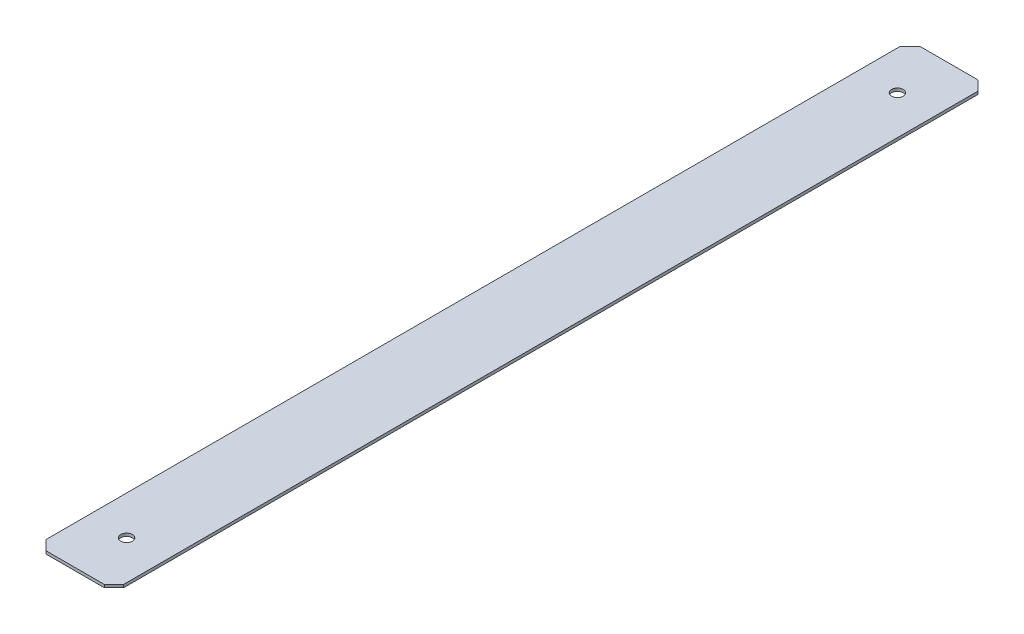
ISO-10303-21;
HEADER;
FILE_DESCRIPTION(('STEP AP214'),'2;1');
FILE_NAME('part.step','',(''),(''),'','','');
FILE_SCHEMA(('AUTOMOTIVE_DESIGN { 1 0 10303 214 1 1 1 1 }'));
ENDSEC;
DATA;
#1=APPLICATION_CONTEXT('core data for automotive mechanical design processes');
#2=APPLICATION_PROTOCOL_DEFINITION('international standard','automotive_design',2000,#1);
#3=PRODUCT_CONTEXT('',#1,'mechanical');
#4=PRODUCT('Part','Part','',(#3));
#5=PRODUCT_RELATED_PRODUCT_CATEGORY('part','',(#4));
#6=PRODUCT_DEFINITION_FORMATION('','',#4);
#7=PRODUCT_DEFINITION_CONTEXT('part definition',#1,'design');
#8=PRODUCT_DEFINITION('design','',#6,#7);
#9=PRODUCT_DEFINITION_SHAPE('','',#8);
#10=(LENGTH_UNIT() NAMED_UNIT(*) SI_UNIT(.MILLI.,.METRE.));
#11=(NAMED_UNIT(*) PLANE_ANGLE_UNIT() SI_UNIT($,.RADIAN.));
#12=(NAMED_UNIT(*) SI_UNIT($,.STERADIAN.) SOLID_ANGLE_UNIT());
#13=UNCERTAINTY_MEASURE_WITH_UNIT(LENGTH_MEASURE(1.E-05),#10,'distance_accuracy_value','');
#14=(GEOMETRIC_REPRESENTATION_CONTEXT(3) GLOBAL_UNCERTAINTY_ASSIGNED_CONTEXT((#13)) GLOBAL_UNIT_ASSIGNED_CONTEXT((#10,
#11,#12)) REPRESENTATION_CONTEXT('',''));
#15=CARTESIAN_POINT('',(0.,0.,0.));
#16=DIRECTION('',(0.,0.,1.));
#17=DIRECTION('',(1.,0.,0.));
#18=AXIS2_PLACEMENT_3D('',#15,#16,#17);
#19=CARTESIAN_POINT('',(20.,1.5,-225.));
#20=DIRECTION('',(-1.,0.,0.));
#21=DIRECTION('',(0.,0.,1.));
#22=AXIS2_PLACEMENT_3D('',#19,#20,#21);
#23=PLANE('',#22);
#24=DIRECTION('',(0.,0.,-1.));
#25=VECTOR('',#24,1.);
#26=CARTESIAN_POINT('',(20.,1.5,-225.));
#27=LINE('',#26,#25);
#28=CARTESIAN_POINT('',(20.0000000000001,1.5,220.));
#29=VERTEX_POINT('',#28);
#30=CARTESIAN_POINT('',(20.,1.5,-220.));
#31=VERTEX_POINT('',#30);
#32=EDGE_CURVE('E125',#29,#31,#27,.T.);
#33=ORIENTED_EDGE('',*,*,#32,.F.);
#34=DIRECTION('',(0.,-1.,0.));
#35=VECTOR('',#34,1.);
#36=CARTESIAN_POINT('',(20.,1.5,220.));
#37=LINE('',#36,#35);
#38=CARTESIAN_POINT('',(20.0000000000001,0.,220.));
#39=VERTEX_POINT('',#38);
#40=EDGE_CURVE('E151',#29,#39,#37,.T.);
#41=ORIENTED_EDGE('',*,*,#40,.T.);
#42=DIRECTION('',(0.,0.,-1.));
#43=VECTOR('',#42,1.);
#44=CARTESIAN_POINT('',(20.,0.,-225.));
#45=LINE('',#44,#43);
#46=CARTESIAN_POINT('',(20.,0.,-220.));
#47=VERTEX_POINT('',#46);
#48=EDGE_CURVE('E157',#39,#47,#45,.T.);
#49=ORIENTED_EDGE('',*,*,#48,.T.);
#50=DIRECTION('',(0.,1.,0.));
#51=VECTOR('',#50,1.);
#52=CARTESIAN_POINT('',(20.,1.5,-220.));
#53=LINE('',#52,#51);
#54=EDGE_CURVE('E149',#47,#31,#53,.T.);
#55=ORIENTED_EDGE('',*,*,#54,.T.);
#56=EDGE_LOOP('',(#33,#41,#49,#55));
#57=FACE_BOUND('',#56,.T.);
#58=ADVANCED_FACE('F33',(#57),#23,.F.);
#59=CARTESIAN_POINT('',(-20.,1.5,-225.));
#60=DIRECTION('',(0.,0.,1.));
#61=DIRECTION('',(1.,0.,0.));
#62=AXIS2_PLACEMENT_3D('',#59,#60,#61);
#63=PLANE('',#62);
#64=DIRECTION('',(-1.,0.,0.));
#65=VECTOR('',#64,1.);
#66=CARTESIAN_POINT('',(-20.,1.5,-225.));
#67=LINE('',#66,#65);
#68=CARTESIAN_POINT('',(15.,1.5,-225.));
#69=VERTEX_POINT('',#68);
#70=CARTESIAN_POINT('',(-15.,1.5,-225.));
#71=VERTEX_POINT('',#70);
#72=EDGE_CURVE('E128',#69,#71,#67,.T.);
#73=ORIENTED_EDGE('',*,*,#72,.F.);
#74=DIRECTION('',(0.,-1.,0.));
#75=VECTOR('',#74,1.);
#76=CARTESIAN_POINT('',(15.,1.5,-225.));
#77=LINE('',#76,#75);
#78=CARTESIAN_POINT('',(15.,0.,-225.));
#79=VERTEX_POINT('',#78);
#80=EDGE_CURVE('E11',#69,#79,#77,.T.);
#81=ORIENTED_EDGE('',*,*,#80,.T.);
#82=DIRECTION('',(-1.,0.,0.));
#83=VECTOR('',#82,1.);
#84=CARTESIAN_POINT('',(-20.,0.,-225.));
#85=LINE('',#84,#83);
#86=CARTESIAN_POINT('',(-15.,0.,-225.));
#87=VERTEX_POINT('',#86);
#88=EDGE_CURVE('E130',#79,#87,#85,.T.);
#89=ORIENTED_EDGE('',*,*,#88,.T.);
#90=DIRECTION('',(0.,1.,0.));
#91=VECTOR('',#90,1.);
#92=CARTESIAN_POINT('',(-15.,1.5,-225.));
#93=LINE('',#92,#91);
#94=EDGE_CURVE('E41',#87,#71,#93,.T.);
#95=ORIENTED_EDGE('',*,*,#94,.T.);
#96=EDGE_LOOP('',(#73,#81,#89,#95));
#97=FACE_BOUND('',#96,.T.);
#98=ADVANCED_FACE('F202',(#97),#63,.F.);
#99=CARTESIAN_POINT('',(-20.,1.5,-225.));
#100=DIRECTION('',(1.,0.,0.));
#101=DIRECTION('',(0.,0.,-1.));
#102=AXIS2_PLACEMENT_3D('',#99,#100,#101);
#103=PLANE('',#102);
#104=DIRECTION('',(0.,0.,1.));
#105=VECTOR('',#104,1.);
#106=CARTESIAN_POINT('',(-20.,0.,-225.));
#107=LINE('',#106,#105);
#108=CARTESIAN_POINT('',(-20.,0.,-220.));
#109=VERTEX_POINT('',#108);
#110=CARTESIAN_POINT('',(-20.,0.,220.));
#111=VERTEX_POINT('',#110);
#112=EDGE_CURVE('E126',#109,#111,#107,.T.);
#113=ORIENTED_EDGE('',*,*,#112,.T.);
#114=DIRECTION('',(0.,1.,0.));
#115=VECTOR('',#114,1.);
#116=CARTESIAN_POINT('',(-20.,1.5,220.));
#117=LINE('',#116,#115);
#118=CARTESIAN_POINT('',(-20.,1.5,220.));
#119=VERTEX_POINT('',#118);
#120=EDGE_CURVE('E104',#111,#119,#117,.T.);
#121=ORIENTED_EDGE('',*,*,#120,.T.);
#122=DIRECTION('',(0.,0.,1.));
#123=VECTOR('',#122,1.);
#124=CARTESIAN_POINT('',(-20.,1.5,-225.));
#125=LINE('',#124,#123);
#126=CARTESIAN_POINT('',(-20.,1.5,-220.));
#127=VERTEX_POINT('',#126);
#128=EDGE_CURVE('E169',#127,#119,#125,.T.);
#129=ORIENTED_EDGE('',*,*,#128,.F.);
#130=DIRECTION('',(0.,-1.,0.));
#131=VECTOR('',#130,1.);
#132=CARTESIAN_POINT('',(-20.,1.5,-220.));
#133=LINE('',#132,#131);
#134=EDGE_CURVE('E109',#127,#109,#133,.T.);
#135=ORIENTED_EDGE('',*,*,#134,.T.);
#136=EDGE_LOOP('',(#113,#121,#129,#135));
#137=FACE_BOUND('',#136,.T.);
#138=ADVANCED_FACE('F200',(#137),#103,.F.);
#139=CARTESIAN_POINT('',(-20.,1.5,225.));
#140=DIRECTION('',(0.,0.,-1.));
#141=DIRECTION('',(-1.,0.,0.));
#142=AXIS2_PLACEMENT_3D('',#139,#140,#141);
#143=PLANE('',#142);
#144=DIRECTION('',(1.,0.,0.));
#145=VECTOR('',#144,1.);
#146=CARTESIAN_POINT('',(-20.,1.5,225.));
#147=LINE('',#146,#145);
#148=CARTESIAN_POINT('',(-14.9999999999999,1.5,225.));
#149=VERTEX_POINT('',#148);
#150=CARTESIAN_POINT('',(15.,1.5,225.));
#151=VERTEX_POINT('',#150);
#152=EDGE_CURVE('E119',#149,#151,#147,.T.);
#153=ORIENTED_EDGE('',*,*,#152,.F.);
#154=DIRECTION('',(0.,-1.,0.));
#155=VECTOR('',#154,1.);
#156=CARTESIAN_POINT('',(-15.,1.5,225.));
#157=LINE('',#156,#155);
#158=CARTESIAN_POINT('',(-15.,0.,225.));
#159=VERTEX_POINT('',#158);
#160=EDGE_CURVE('E103',#149,#159,#157,.T.);
#161=ORIENTED_EDGE('',*,*,#160,.T.);
#162=DIRECTION('',(1.,0.,0.));
#163=VECTOR('',#162,1.);
#164=CARTESIAN_POINT('',(-20.,0.,225.));
#165=LINE('',#164,#163);
#166=CARTESIAN_POINT('',(15.,0.,225.));
#167=VERTEX_POINT('',#166);
#168=EDGE_CURVE('E116',#159,#167,#165,.T.);
#169=ORIENTED_EDGE('',*,*,#168,.T.);
#170=DIRECTION('',(0.,1.,0.));
#171=VECTOR('',#170,1.);
#172=CARTESIAN_POINT('',(15.,1.5,225.));
#173=LINE('',#172,#171);
#174=EDGE_CURVE('E121',#167,#151,#173,.T.);
#175=ORIENTED_EDGE('',*,*,#174,.T.);
#176=EDGE_LOOP('',(#153,#161,#169,#175));
#177=FACE_BOUND('',#176,.T.);
#178=ADVANCED_FACE('F115',(#177),#143,.F.);
#179=CARTESIAN_POINT('',(0.,1.5,0.));
#180=DIRECTION('',(0.,1.,0.));
#181=DIRECTION('',(0.,0.,1.));
#182=AXIS2_PLACEMENT_3D('',#179,#180,#181);
#183=PLANE('',#182);
#184=CARTESIAN_POINT('',(0.,1.5,-198.5));
#185=DIRECTION('',(0.,1.,0.));
#186=DIRECTION('',(0.,0.,1.));
#187=AXIS2_PLACEMENT_3D('',#184,#185,#186);
#188=CIRCLE('',#187,3.);
#189=CARTESIAN_POINT('',(0.,1.5,-195.5));
#190=VERTEX_POINT('',#189);
#191=EDGE_CURVE('E176',#190,#190,#188,.T.);
#192=ORIENTED_EDGE('',*,*,#191,.F.);
#193=EDGE_LOOP('',(#192));
#194=FACE_BOUND('',#193,.T.);
#195=CARTESIAN_POINT('',(0.,1.5,198.5));
#196=DIRECTION('',(0.,1.,0.));
#197=DIRECTION('',(0.,0.,-1.));
#198=AXIS2_PLACEMENT_3D('',#195,#196,#197);
#199=CIRCLE('',#198,3.);
#200=CARTESIAN_POINT('',(0.,1.5,195.5));
#201=VERTEX_POINT('',#200);
#202=EDGE_CURVE('E165',#201,#201,#199,.T.);
#203=ORIENTED_EDGE('',*,*,#202,.F.);
#204=EDGE_LOOP('',(#203));
#205=FACE_BOUND('',#204,.T.);
#206=ORIENTED_EDGE('',*,*,#128,.T.);
#207=DIRECTION('',(-0.707106781186548,0.,-0.707106781186548));
#208=VECTOR('',#207,1.);
#209=CARTESIAN_POINT('',(-120.,1.5,120.));
#210=LINE('',#209,#208);
#211=EDGE_CURVE('E147',#119,#149,#210,.F.);
#212=ORIENTED_EDGE('',*,*,#211,.T.);
#213=ORIENTED_EDGE('',*,*,#152,.T.);
#214=DIRECTION('',(-0.707106781186548,0.,0.707106781186548));
#215=VECTOR('',#214,1.);
#216=CARTESIAN_POINT('',(120.,1.5,120.));
#217=LINE('',#216,#215);
#218=EDGE_CURVE('E145',#151,#29,#217,.F.);
#219=ORIENTED_EDGE('',*,*,#218,.T.);
#220=ORIENTED_EDGE('',*,*,#32,.T.);
#221=DIRECTION('',(0.707106781186548,0.,0.707106781186548));
#222=VECTOR('',#221,1.);
#223=CARTESIAN_POINT('',(120.,1.5,-120.));
#224=LINE('',#223,#222);
#225=EDGE_CURVE('E54',#31,#69,#224,.F.);
#226=ORIENTED_EDGE('',*,*,#225,.T.);
#227=ORIENTED_EDGE('',*,*,#72,.T.);
#228=DIRECTION('',(0.707106781186551,0.,-0.707106781186544));
#229=VECTOR('',#228,1.);
#230=CARTESIAN_POINT('',(-120.,1.5,-120.000000000001));
#231=LINE('',#230,#229);
#232=EDGE_CURVE('E142',#71,#127,#231,.F.);
#233=ORIENTED_EDGE('',*,*,#232,.T.);
#234=EDGE_LOOP('',(#206,#212,#213,#219,#220,#226,#227,#233));
#235=FACE_BOUND('',#234,.T.);
#236=ADVANCED_FACE('F191',(#194,#205,#235),#183,.T.);
#237=CARTESIAN_POINT('',(0.,0.,0.));
#238=DIRECTION('',(0.,1.,0.));
#239=DIRECTION('',(0.,0.,1.));
#240=AXIS2_PLACEMENT_3D('',#237,#238,#239);
#241=PLANE('',#240);
#242=CARTESIAN_POINT('',(0.,0.,-198.5));
#243=DIRECTION('',(0.,1.,0.));
#244=DIRECTION('',(0.,0.,1.));
#245=AXIS2_PLACEMENT_3D('',#242,#243,#244);
#246=CIRCLE('',#245,3.);
#247=CARTESIAN_POINT('',(0.,0.,-195.5));
#248=VERTEX_POINT('',#247);
#249=EDGE_CURVE('E174',#248,#248,#246,.T.);
#250=ORIENTED_EDGE('',*,*,#249,.T.);
#251=EDGE_LOOP('',(#250));
#252=FACE_BOUND('',#251,.T.);
#253=CARTESIAN_POINT('',(0.,0.,198.5));
#254=DIRECTION('',(0.,1.,0.));
#255=DIRECTION('',(0.,0.,-1.));
#256=AXIS2_PLACEMENT_3D('',#253,#254,#255);
#257=CIRCLE('',#256,3.);
#258=CARTESIAN_POINT('',(0.,0.,195.5));
#259=VERTEX_POINT('',#258);
#260=EDGE_CURVE('E162',#259,#259,#257,.T.);
#261=ORIENTED_EDGE('',*,*,#260,.T.);
#262=EDGE_LOOP('',(#261));
#263=FACE_BOUND('',#262,.T.);
#264=ORIENTED_EDGE('',*,*,#168,.F.);
#265=DIRECTION('',(0.707106781186548,0.,0.707106781186548));
#266=VECTOR('',#265,1.);
#267=CARTESIAN_POINT('',(-15.,0.,225.));
#268=LINE('',#267,#266);
#269=EDGE_CURVE('E99',#159,#111,#268,.F.);
#270=ORIENTED_EDGE('',*,*,#269,.T.);
#271=ORIENTED_EDGE('',*,*,#112,.F.);
#272=DIRECTION('',(-0.707106781186551,0.,0.707106781186544));
#273=VECTOR('',#272,1.);
#274=CARTESIAN_POINT('',(-20.,0.,-220.));
#275=LINE('',#274,#273);
#276=EDGE_CURVE('E120',#109,#87,#275,.F.);
#277=ORIENTED_EDGE('',*,*,#276,.T.);
#278=ORIENTED_EDGE('',*,*,#88,.F.);
#279=DIRECTION('',(-0.707106781186548,0.,-0.707106781186548));
#280=VECTOR('',#279,1.);
#281=CARTESIAN_POINT('',(15.,0.,-225.));
#282=LINE('',#281,#280);
#283=EDGE_CURVE('E136',#79,#47,#282,.F.);
#284=ORIENTED_EDGE('',*,*,#283,.T.);
#285=ORIENTED_EDGE('',*,*,#48,.F.);
#286=DIRECTION('',(0.707106781186548,0.,-0.707106781186548));
#287=VECTOR('',#286,1.);
#288=CARTESIAN_POINT('',(20.,0.,220.));
#289=LINE('',#288,#287);
#290=EDGE_CURVE('E110',#39,#167,#289,.F.);
#291=ORIENTED_EDGE('',*,*,#290,.T.);
#292=EDGE_LOOP('',(#264,#270,#271,#277,#278,#284,#285,#291));
#293=FACE_BOUND('',#292,.T.);
#294=ADVANCED_FACE('F123',(#252,#263,#293),#241,.F.);
#295=CARTESIAN_POINT('',(-15.,1.5,225.));
#296=DIRECTION('',(0.707106781186547,0.,-0.707106781186547));
#297=DIRECTION('',(0.,-1.,0.));
#298=AXIS2_PLACEMENT_3D('',#295,#296,#297);
#299=PLANE('',#298);
#300=ORIENTED_EDGE('',*,*,#211,.F.);
#301=ORIENTED_EDGE('',*,*,#120,.F.);
#302=ORIENTED_EDGE('',*,*,#269,.F.);
#303=ORIENTED_EDGE('',*,*,#160,.F.);
#304=EDGE_LOOP('',(#300,#301,#302,#303));
#305=FACE_BOUND('',#304,.T.);
#306=ADVANCED_FACE('F102',(#305),#299,.F.);
#307=CARTESIAN_POINT('',(20.,1.5,220.));
#308=DIRECTION('',(-0.707106781186547,0.,-0.707106781186547));
#309=DIRECTION('',(0.,-1.,0.));
#310=AXIS2_PLACEMENT_3D('',#307,#308,#309);
#311=PLANE('',#310);
#312=ORIENTED_EDGE('',*,*,#218,.F.);
#313=ORIENTED_EDGE('',*,*,#174,.F.);
#314=ORIENTED_EDGE('',*,*,#290,.F.);
#315=ORIENTED_EDGE('',*,*,#40,.F.);
#316=EDGE_LOOP('',(#312,#313,#314,#315));
#317=FACE_BOUND('',#316,.T.);
#318=ADVANCED_FACE('F206',(#317),#311,.F.);
#319=CARTESIAN_POINT('',(15.,1.5,-225.));
#320=DIRECTION('',(-0.707106781186547,0.,0.707106781186547));
#321=DIRECTION('',(0.,-1.,0.));
#322=AXIS2_PLACEMENT_3D('',#319,#320,#321);
#323=PLANE('',#322);
#324=ORIENTED_EDGE('',*,*,#225,.F.);
#325=ORIENTED_EDGE('',*,*,#54,.F.);
#326=ORIENTED_EDGE('',*,*,#283,.F.);
#327=ORIENTED_EDGE('',*,*,#80,.F.);
#328=EDGE_LOOP('',(#324,#325,#326,#327));
#329=FACE_BOUND('',#328,.T.);
#330=ADVANCED_FACE('F205',(#329),#323,.F.);
#331=CARTESIAN_POINT('',(-20.,1.5,-220.));
#332=DIRECTION('',(0.707106781186544,0.,0.707106781186551));
#333=DIRECTION('',(0.,-1.,0.));
#334=AXIS2_PLACEMENT_3D('',#331,#332,#333);
#335=PLANE('',#334);
#336=ORIENTED_EDGE('',*,*,#232,.F.);
#337=ORIENTED_EDGE('',*,*,#94,.F.);
#338=ORIENTED_EDGE('',*,*,#276,.F.);
#339=ORIENTED_EDGE('',*,*,#134,.F.);
#340=EDGE_LOOP('',(#336,#337,#338,#339));
#341=FACE_BOUND('',#340,.T.);
#342=ADVANCED_FACE('F35',(#341),#335,.F.);
#343=CARTESIAN_POINT('',(0.,0.,198.5));
#344=DIRECTION('',(0.,1.,0.));
#345=DIRECTION('',(0.,0.,1.));
#346=AXIS2_PLACEMENT_3D('',#343,#344,#345);
#347=CYLINDRICAL_SURFACE('',#346,3.);
#348=ORIENTED_EDGE('',*,*,#260,.F.);
#349=EDGE_LOOP('',(#348));
#350=FACE_BOUND('',#349,.T.);
#351=ORIENTED_EDGE('',*,*,#202,.T.);
#352=EDGE_LOOP('',(#351));
#353=FACE_BOUND('',#352,.T.);
#354=ADVANCED_FACE('F187',(#350,#353),#347,.F.);
#355=CARTESIAN_POINT('',(0.,0.,-198.5));
#356=DIRECTION('',(0.,1.,0.));
#357=DIRECTION('',(0.,0.,1.));
#358=AXIS2_PLACEMENT_3D('',#355,#356,#357);
#359=CYLINDRICAL_SURFACE('',#358,3.);
#360=ORIENTED_EDGE('',*,*,#249,.F.);
#361=EDGE_LOOP('',(#360));
#362=FACE_BOUND('',#361,.T.);
#363=ORIENTED_EDGE('',*,*,#191,.T.);
#364=EDGE_LOOP('',(#363));
#365=FACE_BOUND('',#364,.T.);
#366=ADVANCED_FACE('F184',(#362,#365),#359,.F.);
#367=CLOSED_SHELL('',(#58,#98,#138,#178,#236,#294,#306,#318,#330,#342,#354,#366));
#368=MANIFOLD_SOLID_BREP('B2',#367);
#369=ADVANCED_BREP_SHAPE_REPRESENTATION('',(#18,#368),#14);
#370=SHAPE_DEFINITION_REPRESENTATION(#9,#369);
ENDSEC;
END-ISO-10303-21;
